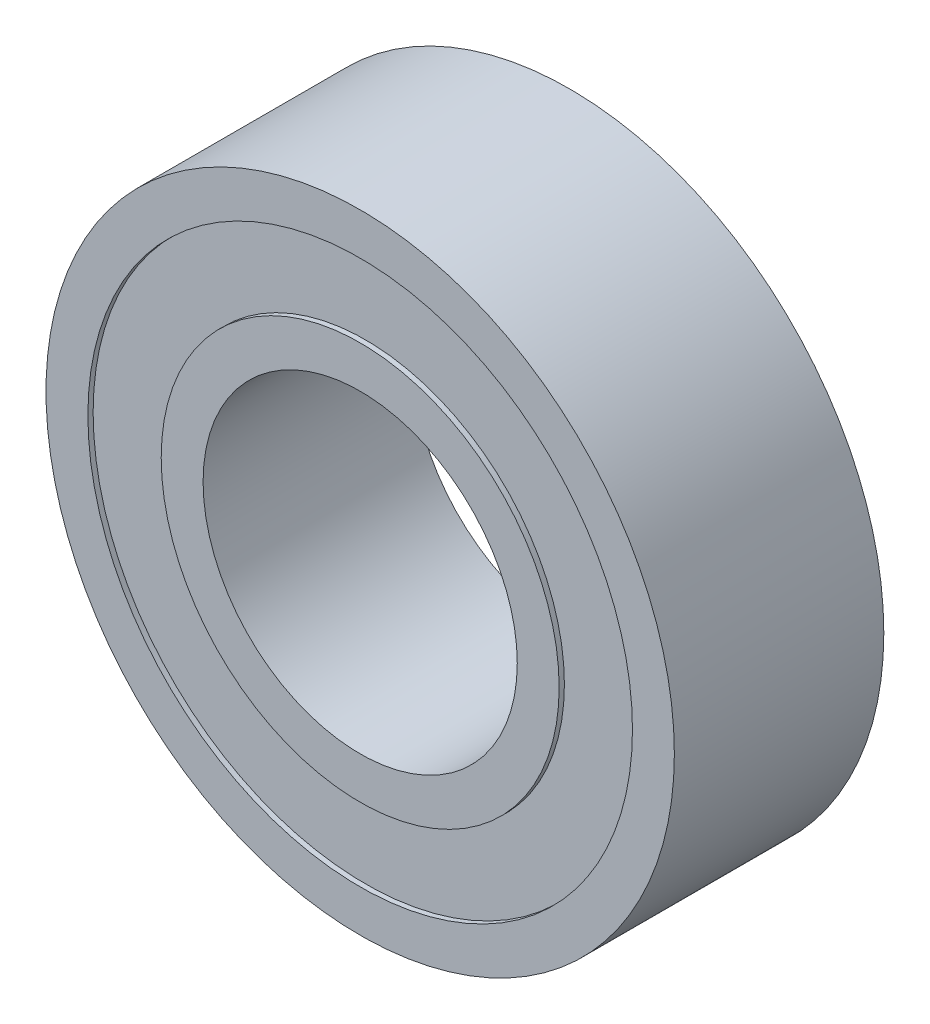
ISO-10303-21;
HEADER;
FILE_DESCRIPTION(('STEP AP214'),'2;1');
FILE_NAME('part.step','',(''),(''),'','','');
FILE_SCHEMA(('AUTOMOTIVE_DESIGN { 1 0 10303 214 1 1 1 1 }'));
ENDSEC;
DATA;
#1=APPLICATION_CONTEXT('core data for automotive mechanical design processes');
#2=APPLICATION_PROTOCOL_DEFINITION('international standard','automotive_design',2000,#1);
#3=PRODUCT_CONTEXT('',#1,'mechanical');
#4=PRODUCT('Part','Part','',(#3));
#5=PRODUCT_RELATED_PRODUCT_CATEGORY('part','',(#4));
#6=PRODUCT_DEFINITION_FORMATION('','',#4);
#7=PRODUCT_DEFINITION_CONTEXT('part definition',#1,'design');
#8=PRODUCT_DEFINITION('design','',#6,#7);
#9=PRODUCT_DEFINITION_SHAPE('','',#8);
#10=(LENGTH_UNIT() NAMED_UNIT(*) SI_UNIT(.MILLI.,.METRE.));
#11=(NAMED_UNIT(*) PLANE_ANGLE_UNIT() SI_UNIT($,.RADIAN.));
#12=(NAMED_UNIT(*) SI_UNIT($,.STERADIAN.) SOLID_ANGLE_UNIT());
#13=UNCERTAINTY_MEASURE_WITH_UNIT(LENGTH_MEASURE(1.E-05),#10,'distance_accuracy_value','');
#14=(GEOMETRIC_REPRESENTATION_CONTEXT(3) GLOBAL_UNCERTAINTY_ASSIGNED_CONTEXT((#13)) GLOBAL_UNIT_ASSIGNED_CONTEXT((#10,
#11,#12)) REPRESENTATION_CONTEXT('',''));
#15=CARTESIAN_POINT('',(0.,0.,0.));
#16=DIRECTION('',(0.,0.,1.));
#17=DIRECTION('',(1.,0.,0.));
#18=AXIS2_PLACEMENT_3D('',#15,#16,#17);
#19=CARTESIAN_POINT('',(0.,0.,-2.));
#20=DIRECTION('',(0.,0.,1.));
#21=DIRECTION('',(1.,0.,0.));
#22=AXIS2_PLACEMENT_3D('',#19,#20,#21);
#23=PLANE('',#22);
#24=CARTESIAN_POINT('',(0.,0.,-2.));
#25=DIRECTION('',(0.,0.,1.));
#26=DIRECTION('',(1.,0.,0.));
#27=AXIS2_PLACEMENT_3D('',#24,#25,#26);
#28=CIRCLE('',#27,3.);
#29=CARTESIAN_POINT('',(3.,0.,-2.));
#30=VERTEX_POINT('',#29);
#31=EDGE_CURVE('E49',#30,#30,#28,.T.);
#32=ORIENTED_EDGE('',*,*,#31,.T.);
#33=EDGE_LOOP('',(#32));
#34=FACE_BOUND('',#33,.T.);
#35=CARTESIAN_POINT('',(0.,0.,-2.));
#36=DIRECTION('',(0.,0.,1.));
#37=DIRECTION('',(1.,0.,0.));
#38=AXIS2_PLACEMENT_3D('',#35,#36,#37);
#39=CIRCLE('',#38,3.8);
#40=CARTESIAN_POINT('',(3.8,0.,-2.));
#41=VERTEX_POINT('',#40);
#42=EDGE_CURVE('E74',#41,#41,#39,.T.);
#43=ORIENTED_EDGE('',*,*,#42,.F.);
#44=EDGE_LOOP('',(#43));
#45=FACE_BOUND('',#44,.T.);
#46=ADVANCED_FACE('F40',(#34,#45),#23,.F.);
#47=CARTESIAN_POINT('',(0.,0.,2.));
#48=DIRECTION('',(0.,0.,1.));
#49=DIRECTION('',(1.,0.,0.));
#50=AXIS2_PLACEMENT_3D('',#47,#48,#49);
#51=PLANE('',#50);
#52=CARTESIAN_POINT('',(0.,0.,2.));
#53=DIRECTION('',(0.,0.,1.));
#54=DIRECTION('',(1.,0.,0.));
#55=AXIS2_PLACEMENT_3D('',#52,#53,#54);
#56=CIRCLE('',#55,3.);
#57=CARTESIAN_POINT('',(3.,0.,2.));
#58=VERTEX_POINT('',#57);
#59=EDGE_CURVE('E48',#58,#58,#56,.T.);
#60=ORIENTED_EDGE('',*,*,#59,.F.);
#61=EDGE_LOOP('',(#60));
#62=FACE_BOUND('',#61,.T.);
#63=CARTESIAN_POINT('',(0.,0.,2.));
#64=DIRECTION('',(0.,0.,1.));
#65=DIRECTION('',(1.,0.,0.));
#66=AXIS2_PLACEMENT_3D('',#63,#64,#65);
#67=CIRCLE('',#66,3.8);
#68=CARTESIAN_POINT('',(3.8,0.,2.));
#69=VERTEX_POINT('',#68);
#70=EDGE_CURVE('E65',#69,#69,#67,.T.);
#71=ORIENTED_EDGE('',*,*,#70,.T.);
#72=EDGE_LOOP('',(#71));
#73=FACE_BOUND('',#72,.T.);
#74=ADVANCED_FACE('F89',(#62,#73),#51,.T.);
#75=CARTESIAN_POINT('',(0.,0.,2.));
#76=DIRECTION('',(0.,0.,1.));
#77=DIRECTION('',(1.,0.,0.));
#78=AXIS2_PLACEMENT_3D('',#75,#76,#77);
#79=CIRCLE('',#78,5.2);
#80=CARTESIAN_POINT('',(5.2,0.,2.));
#81=VERTEX_POINT('',#80);
#82=EDGE_CURVE('E57',#81,#81,#79,.T.);
#83=ORIENTED_EDGE('',*,*,#82,.F.);
#84=EDGE_LOOP('',(#83));
#85=FACE_BOUND('',#84,.T.);
#86=CARTESIAN_POINT('',(0.,0.,2.));
#87=DIRECTION('',(0.,0.,1.));
#88=DIRECTION('',(1.,0.,0.));
#89=AXIS2_PLACEMENT_3D('',#86,#87,#88);
#90=CIRCLE('',#89,6.);
#91=CARTESIAN_POINT('',(6.,0.,2.));
#92=VERTEX_POINT('',#91);
#93=EDGE_CURVE('E10',#92,#92,#90,.T.);
#94=ORIENTED_EDGE('',*,*,#93,.T.);
#95=EDGE_LOOP('',(#94));
#96=FACE_BOUND('',#95,.T.);
#97=ADVANCED_FACE('F98',(#85,#96),#51,.T.);
#98=CARTESIAN_POINT('',(0.,0.,-2.));
#99=DIRECTION('',(0.,0.,1.));
#100=DIRECTION('',(1.,0.,0.));
#101=AXIS2_PLACEMENT_3D('',#98,#99,#100);
#102=CIRCLE('',#101,5.2);
#103=CARTESIAN_POINT('',(5.2,0.,-2.));
#104=VERTEX_POINT('',#103);
#105=EDGE_CURVE('E68',#104,#104,#102,.T.);
#106=ORIENTED_EDGE('',*,*,#105,.T.);
#107=EDGE_LOOP('',(#106));
#108=FACE_BOUND('',#107,.T.);
#109=CARTESIAN_POINT('',(0.,0.,-2.));
#110=DIRECTION('',(0.,0.,1.));
#111=DIRECTION('',(1.,0.,0.));
#112=AXIS2_PLACEMENT_3D('',#109,#110,#111);
#113=CIRCLE('',#112,6.);
#114=CARTESIAN_POINT('',(6.,0.,-2.));
#115=VERTEX_POINT('',#114);
#116=EDGE_CURVE('E41',#115,#115,#113,.T.);
#117=ORIENTED_EDGE('',*,*,#116,.F.);
#118=EDGE_LOOP('',(#117));
#119=FACE_BOUND('',#118,.T.);
#120=ADVANCED_FACE('F95',(#108,#119),#23,.F.);
#121=CARTESIAN_POINT('',(0.,0.,2.));
#122=DIRECTION('',(0.,0.,-1.));
#123=DIRECTION('',(-1.,0.,0.));
#124=AXIS2_PLACEMENT_3D('',#121,#122,#123);
#125=CYLINDRICAL_SURFACE('',#124,6.);
#126=ORIENTED_EDGE('',*,*,#93,.F.);
#127=EDGE_LOOP('',(#126));
#128=FACE_BOUND('',#127,.T.);
#129=ORIENTED_EDGE('',*,*,#116,.T.);
#130=EDGE_LOOP('',(#129));
#131=FACE_BOUND('',#130,.T.);
#132=ADVANCED_FACE('F39',(#128,#131),#125,.T.);
#133=CARTESIAN_POINT('',(0.,0.,2.));
#134=DIRECTION('',(0.,0.,-1.));
#135=DIRECTION('',(-1.,0.,0.));
#136=AXIS2_PLACEMENT_3D('',#133,#134,#135);
#137=CYLINDRICAL_SURFACE('',#136,3.);
#138=ORIENTED_EDGE('',*,*,#59,.T.);
#139=EDGE_LOOP('',(#138));
#140=FACE_BOUND('',#139,.T.);
#141=ORIENTED_EDGE('',*,*,#31,.F.);
#142=EDGE_LOOP('',(#141));
#143=FACE_BOUND('',#142,.T.);
#144=ADVANCED_FACE('F106',(#140,#143),#137,.F.);
#145=CARTESIAN_POINT('',(0.,0.,1.9));
#146=DIRECTION('',(0.,0.,1.));
#147=DIRECTION('',(1.,0.,0.));
#148=AXIS2_PLACEMENT_3D('',#145,#146,#147);
#149=CYLINDRICAL_SURFACE('',#148,5.2);
#150=CARTESIAN_POINT('',(0.,0.,1.9));
#151=DIRECTION('',(0.,0.,1.));
#152=DIRECTION('',(1.,0.,0.));
#153=AXIS2_PLACEMENT_3D('',#150,#151,#152);
#154=CIRCLE('',#153,5.2);
#155=CARTESIAN_POINT('',(5.2,0.,1.9));
#156=VERTEX_POINT('',#155);
#157=EDGE_CURVE('E52',#156,#156,#154,.T.);
#158=ORIENTED_EDGE('',*,*,#157,.F.);
#159=EDGE_LOOP('',(#158));
#160=FACE_BOUND('',#159,.T.);
#161=ORIENTED_EDGE('',*,*,#82,.T.);
#162=EDGE_LOOP('',(#161));
#163=FACE_BOUND('',#162,.T.);
#164=ADVANCED_FACE('F129',(#160,#163),#149,.F.);
#165=CARTESIAN_POINT('',(0.,0.,1.9));
#166=DIRECTION('',(0.,0.,1.));
#167=DIRECTION('',(1.,0.,0.));
#168=AXIS2_PLACEMENT_3D('',#165,#166,#167);
#169=PLANE('',#168);
#170=CARTESIAN_POINT('',(0.,0.,1.9));
#171=DIRECTION('',(0.,0.,1.));
#172=DIRECTION('',(1.,0.,0.));
#173=AXIS2_PLACEMENT_3D('',#170,#171,#172);
#174=CIRCLE('',#173,3.8);
#175=CARTESIAN_POINT('',(3.8,0.,1.9));
#176=VERTEX_POINT('',#175);
#177=EDGE_CURVE('E56',#176,#176,#174,.T.);
#178=ORIENTED_EDGE('',*,*,#177,.F.);
#179=EDGE_LOOP('',(#178));
#180=FACE_BOUND('',#179,.T.);
#181=ORIENTED_EDGE('',*,*,#157,.T.);
#182=EDGE_LOOP('',(#181));
#183=FACE_BOUND('',#182,.T.);
#184=ADVANCED_FACE('F124',(#180,#183),#169,.T.);
#185=CARTESIAN_POINT('',(0.,0.,1.9));
#186=DIRECTION('',(0.,0.,1.));
#187=DIRECTION('',(1.,0.,0.));
#188=AXIS2_PLACEMENT_3D('',#185,#186,#187);
#189=CYLINDRICAL_SURFACE('',#188,3.8);
#190=ORIENTED_EDGE('',*,*,#177,.T.);
#191=EDGE_LOOP('',(#190));
#192=FACE_BOUND('',#191,.T.);
#193=ORIENTED_EDGE('',*,*,#70,.F.);
#194=EDGE_LOOP('',(#193));
#195=FACE_BOUND('',#194,.T.);
#196=ADVANCED_FACE('F119',(#192,#195),#189,.T.);
#197=CARTESIAN_POINT('',(0.,0.,-1.9));
#198=DIRECTION('',(0.,0.,-1.));
#199=DIRECTION('',(1.,0.,0.));
#200=AXIS2_PLACEMENT_3D('',#197,#198,#199);
#201=PLANE('',#200);
#202=CARTESIAN_POINT('',(0.,0.,-1.9));
#203=DIRECTION('',(0.,0.,1.));
#204=DIRECTION('',(1.,0.,0.));
#205=AXIS2_PLACEMENT_3D('',#202,#203,#204);
#206=CIRCLE('',#205,5.2);
#207=CARTESIAN_POINT('',(5.2,0.,-1.9));
#208=VERTEX_POINT('',#207);
#209=EDGE_CURVE('E64',#208,#208,#206,.T.);
#210=ORIENTED_EDGE('',*,*,#209,.F.);
#211=EDGE_LOOP('',(#210));
#212=FACE_BOUND('',#211,.T.);
#213=CARTESIAN_POINT('',(0.,0.,-1.9));
#214=DIRECTION('',(0.,0.,1.));
#215=DIRECTION('',(1.,0.,0.));
#216=AXIS2_PLACEMENT_3D('',#213,#214,#215);
#217=CIRCLE('',#216,3.8);
#218=CARTESIAN_POINT('',(3.8,0.,-1.9));
#219=VERTEX_POINT('',#218);
#220=EDGE_CURVE('E72',#219,#219,#217,.T.);
#221=ORIENTED_EDGE('',*,*,#220,.T.);
#222=EDGE_LOOP('',(#221));
#223=FACE_BOUND('',#222,.T.);
#224=ADVANCED_FACE('F79',(#212,#223),#201,.T.);
#225=CARTESIAN_POINT('',(0.,0.,-1.9));
#226=DIRECTION('',(0.,0.,-1.));
#227=DIRECTION('',(-1.,0.,0.));
#228=AXIS2_PLACEMENT_3D('',#225,#226,#227);
#229=CYLINDRICAL_SURFACE('',#228,5.2);
#230=ORIENTED_EDGE('',*,*,#209,.T.);
#231=EDGE_LOOP('',(#230));
#232=FACE_BOUND('',#231,.T.);
#233=ORIENTED_EDGE('',*,*,#105,.F.);
#234=EDGE_LOOP('',(#233));
#235=FACE_BOUND('',#234,.T.);
#236=ADVANCED_FACE('F84',(#232,#235),#229,.F.);
#237=CARTESIAN_POINT('',(0.,0.,-1.9));
#238=DIRECTION('',(0.,0.,-1.));
#239=DIRECTION('',(-1.,0.,0.));
#240=AXIS2_PLACEMENT_3D('',#237,#238,#239);
#241=CYLINDRICAL_SURFACE('',#240,3.8);
#242=ORIENTED_EDGE('',*,*,#220,.F.);
#243=EDGE_LOOP('',(#242));
#244=FACE_BOUND('',#243,.T.);
#245=ORIENTED_EDGE('',*,*,#42,.T.);
#246=EDGE_LOOP('',(#245));
#247=FACE_BOUND('',#246,.T.);
#248=ADVANCED_FACE('F85',(#244,#247),#241,.T.);
#249=CLOSED_SHELL('',(#46,#74,#97,#120,#132,#144,#164,#184,#196,#224,#236,#248));
#250=MANIFOLD_SOLID_BREP('B2',#249);
#251=ADVANCED_BREP_SHAPE_REPRESENTATION('',(#18,#250),#14);
#252=SHAPE_DEFINITION_REPRESENTATION(#9,#251);
ENDSEC;
END-ISO-10303-21;
